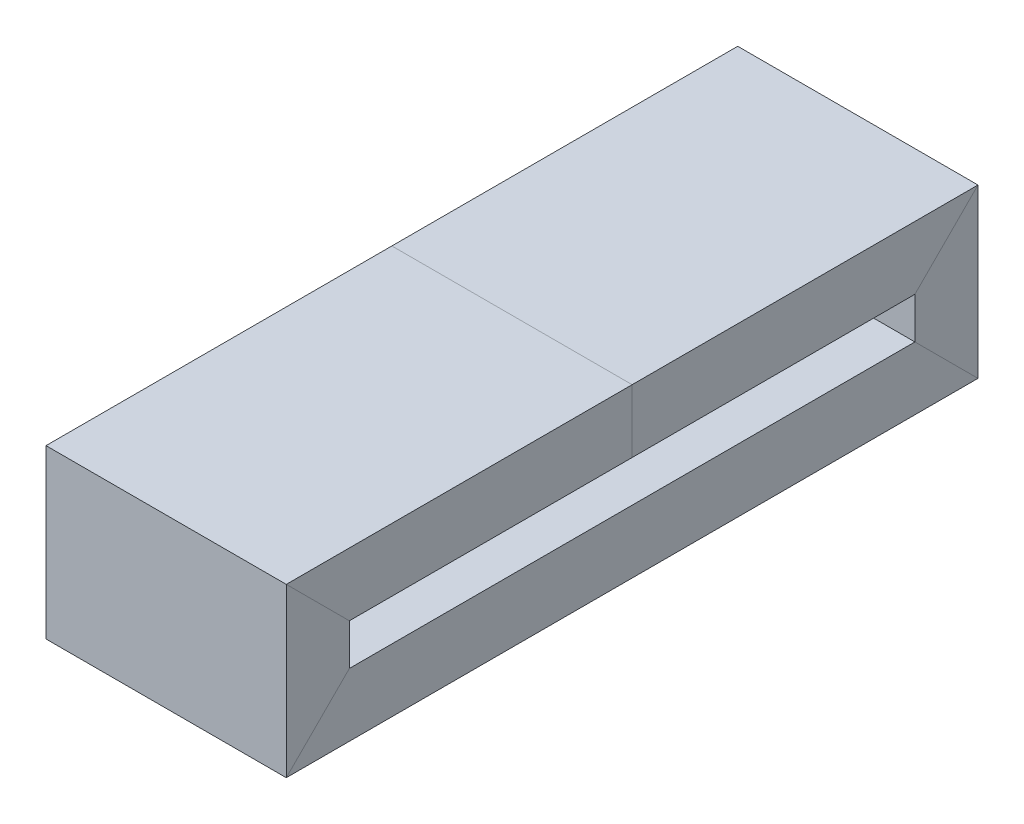
ISO-10303-21;
HEADER;
FILE_DESCRIPTION(('STEP AP214'),'2;1');
FILE_NAME('part.step','',(''),(''),'','','');
FILE_SCHEMA(('AUTOMOTIVE_DESIGN { 1 0 10303 214 1 1 1 1 }'));
ENDSEC;
DATA;
#1=APPLICATION_CONTEXT('core data for automotive mechanical design processes');
#2=APPLICATION_PROTOCOL_DEFINITION('international standard','automotive_design',2000,#1);
#3=PRODUCT_CONTEXT('',#1,'mechanical');
#4=PRODUCT('Part','Part','',(#3));
#5=PRODUCT_RELATED_PRODUCT_CATEGORY('part','',(#4));
#6=PRODUCT_DEFINITION_FORMATION('','',#4);
#7=PRODUCT_DEFINITION_CONTEXT('part definition',#1,'design');
#8=PRODUCT_DEFINITION('design','',#6,#7);
#9=PRODUCT_DEFINITION_SHAPE('','',#8);
#10=(LENGTH_UNIT() NAMED_UNIT(*) SI_UNIT(.MILLI.,.METRE.));
#11=(NAMED_UNIT(*) PLANE_ANGLE_UNIT() SI_UNIT($,.RADIAN.));
#12=(NAMED_UNIT(*) SI_UNIT($,.STERADIAN.) SOLID_ANGLE_UNIT());
#13=UNCERTAINTY_MEASURE_WITH_UNIT(LENGTH_MEASURE(1.E-05),#10,'distance_accuracy_value','');
#14=(GEOMETRIC_REPRESENTATION_CONTEXT(3) GLOBAL_UNCERTAINTY_ASSIGNED_CONTEXT((#13)) GLOBAL_UNIT_ASSIGNED_CONTEXT((#10,
#11,#12)) REPRESENTATION_CONTEXT('',''));
#15=CARTESIAN_POINT('',(0.,0.,0.));
#16=DIRECTION('',(0.,0.,1.));
#17=DIRECTION('',(1.,0.,0.));
#18=AXIS2_PLACEMENT_3D('',#15,#16,#17);
#19=CARTESIAN_POINT('',(-4.95,-3.68,11.65));
#20=DIRECTION('',(0.,0.,1.));
#21=DIRECTION('',(1.,0.,0.));
#22=AXIS2_PLACEMENT_3D('',#19,#20,#21);
#23=PLANE('',#22);
#24=DIRECTION('',(0.,1.,0.));
#25=VECTOR('',#24,1.);
#26=CARTESIAN_POINT('',(4.95,-3.68,11.65));
#27=LINE('',#26,#25);
#28=CARTESIAN_POINT('',(4.95,-0.849999999999999,11.65));
#29=VERTEX_POINT('',#28);
#30=CARTESIAN_POINT('',(4.95,0.849999999999999,11.65));
#31=VERTEX_POINT('',#30);
#32=EDGE_CURVE('E40',#29,#31,#27,.T.);
#33=ORIENTED_EDGE('',*,*,#32,.F.);
#34=DIRECTION('',(-1.,0.,0.));
#35=VECTOR('',#34,1.);
#36=CARTESIAN_POINT('',(-4.95,-0.849999999999998,11.65));
#37=LINE('',#36,#35);
#38=CARTESIAN_POINT('',(-4.95,-0.849999999999999,11.65));
#39=VERTEX_POINT('',#38);
#40=EDGE_CURVE('E180',#29,#39,#37,.T.);
#41=ORIENTED_EDGE('',*,*,#40,.T.);
#42=DIRECTION('',(0.,1.,0.));
#43=VECTOR('',#42,1.);
#44=CARTESIAN_POINT('',(-4.95,-3.68,11.65));
#45=LINE('',#44,#43);
#46=CARTESIAN_POINT('',(-4.95,0.849999999999999,11.65));
#47=VERTEX_POINT('',#46);
#48=EDGE_CURVE('E166',#39,#47,#45,.T.);
#49=ORIENTED_EDGE('',*,*,#48,.T.);
#50=DIRECTION('',(-1.,0.,0.));
#51=VECTOR('',#50,1.);
#52=CARTESIAN_POINT('',(-4.95,0.85,11.65));
#53=LINE('',#52,#51);
#54=EDGE_CURVE('E96',#31,#47,#53,.T.);
#55=ORIENTED_EDGE('',*,*,#54,.F.);
#56=EDGE_LOOP('',(#33,#41,#49,#55));
#57=FACE_BOUND('',#56,.T.);
#58=ADVANCED_FACE('F37',(#57),#23,.F.);
#59=CARTESIAN_POINT('',(-4.95,-3.68,11.65));
#60=DIRECTION('',(1.,0.,0.));
#61=DIRECTION('',(0.,0.,-1.));
#62=AXIS2_PLACEMENT_3D('',#59,#60,#61);
#63=PLANE('',#62);
#64=ORIENTED_EDGE('',*,*,#48,.F.);
#65=DIRECTION('',(0.,-0.707106781186548,0.707106781186548));
#66=VECTOR('',#65,1.);
#67=CARTESIAN_POINT('',(-4.95,12.215,-1.415));
#68=LINE('',#67,#66);
#69=CARTESIAN_POINT('',(-4.95,-3.45,14.25));
#70=VERTEX_POINT('',#69);
#71=EDGE_CURVE('E175',#39,#70,#68,.T.);
#72=ORIENTED_EDGE('',*,*,#71,.T.);
#73=DIRECTION('',(0.,1.,0.));
#74=VECTOR('',#73,1.);
#75=CARTESIAN_POINT('',(-4.95,-3.68,14.25));
#76=LINE('',#75,#74);
#77=CARTESIAN_POINT('',(-4.95,3.45,14.25));
#78=VERTEX_POINT('',#77);
#79=EDGE_CURVE('E124',#70,#78,#76,.T.);
#80=ORIENTED_EDGE('',*,*,#79,.T.);
#81=DIRECTION('',(0.,0.707106781186548,0.707106781186548));
#82=VECTOR('',#81,1.);
#83=CARTESIAN_POINT('',(-4.95,2.265,13.065));
#84=LINE('',#83,#82);
#85=EDGE_CURVE('E112',#47,#78,#84,.T.);
#86=ORIENTED_EDGE('',*,*,#85,.F.);
#87=EDGE_LOOP('',(#64,#72,#80,#86));
#88=FACE_BOUND('',#87,.T.);
#89=ADVANCED_FACE('F173',(#88),#63,.F.);
#90=CARTESIAN_POINT('',(-4.95,-3.68,14.25));
#91=DIRECTION('',(0.,0.,-1.));
#92=DIRECTION('',(-1.,0.,0.));
#93=AXIS2_PLACEMENT_3D('',#90,#91,#92);
#94=PLANE('',#93);
#95=ORIENTED_EDGE('',*,*,#79,.F.);
#96=DIRECTION('',(1.,0.,0.));
#97=VECTOR('',#96,1.);
#98=CARTESIAN_POINT('',(-4.95,-3.45,14.25));
#99=LINE('',#98,#97);
#100=CARTESIAN_POINT('',(4.95,-3.45,14.25));
#101=VERTEX_POINT('',#100);
#102=EDGE_CURVE('E120',#70,#101,#99,.T.);
#103=ORIENTED_EDGE('',*,*,#102,.T.);
#104=DIRECTION('',(0.,1.,0.));
#105=VECTOR('',#104,1.);
#106=CARTESIAN_POINT('',(4.95,-3.68,14.25));
#107=LINE('',#106,#105);
#108=CARTESIAN_POINT('',(4.95,3.45,14.25));
#109=VERTEX_POINT('',#108);
#110=EDGE_CURVE('E117',#101,#109,#107,.T.);
#111=ORIENTED_EDGE('',*,*,#110,.T.);
#112=DIRECTION('',(1.,0.,0.));
#113=VECTOR('',#112,1.);
#114=CARTESIAN_POINT('',(-4.95,3.45,14.25));
#115=LINE('',#114,#113);
#116=EDGE_CURVE('E102',#78,#109,#115,.T.);
#117=ORIENTED_EDGE('',*,*,#116,.F.);
#118=EDGE_LOOP('',(#95,#103,#111,#117));
#119=FACE_BOUND('',#118,.T.);
#120=ADVANCED_FACE('F119',(#119),#94,.F.);
#121=CARTESIAN_POINT('',(4.95,-3.68,11.65));
#122=DIRECTION('',(-1.,0.,0.));
#123=DIRECTION('',(0.,0.,1.));
#124=AXIS2_PLACEMENT_3D('',#121,#122,#123);
#125=PLANE('',#124);
#126=ORIENTED_EDGE('',*,*,#110,.F.);
#127=DIRECTION('',(0.,0.707106781186548,-0.707106781186548));
#128=VECTOR('',#127,1.);
#129=CARTESIAN_POINT('',(4.95,12.215,-1.415));
#130=LINE('',#129,#128);
#131=EDGE_CURVE('E201',#101,#29,#130,.T.);
#132=ORIENTED_EDGE('',*,*,#131,.T.);
#133=ORIENTED_EDGE('',*,*,#32,.T.);
#134=DIRECTION('',(0.,-0.707106781186548,-0.707106781186548));
#135=VECTOR('',#134,1.);
#136=CARTESIAN_POINT('',(4.95,2.265,13.065));
#137=LINE('',#136,#135);
#138=EDGE_CURVE('E126',#109,#31,#137,.T.);
#139=ORIENTED_EDGE('',*,*,#138,.F.);
#140=EDGE_LOOP('',(#126,#132,#133,#139));
#141=FACE_BOUND('',#140,.T.);
#142=ADVANCED_FACE('F127',(#141),#125,.F.);
#143=CARTESIAN_POINT('',(4.95,0.85,14.48));
#144=DIRECTION('',(-1.,0.,0.));
#145=DIRECTION('',(0.,0.,1.));
#146=AXIS2_PLACEMENT_3D('',#143,#144,#145);
#147=PLANE('',#146);
#148=ORIENTED_EDGE('',*,*,#138,.T.);
#149=DIRECTION('',(0.,0.,-1.));
#150=VECTOR('',#149,1.);
#151=CARTESIAN_POINT('',(4.95,0.85,14.48));
#152=LINE('',#151,#150);
#153=CARTESIAN_POINT('',(4.95,0.85,0.));
#154=VERTEX_POINT('',#153);
#155=EDGE_CURVE('E136',#31,#154,#152,.T.);
#156=ORIENTED_EDGE('',*,*,#155,.T.);
#157=DIRECTION('',(0.,1.,0.));
#158=VECTOR('',#157,1.);
#159=CARTESIAN_POINT('',(4.95,0.85,0.));
#160=LINE('',#159,#158);
#161=CARTESIAN_POINT('',(4.95,3.45,0.));
#162=VERTEX_POINT('',#161);
#163=EDGE_CURVE('E135',#154,#162,#160,.T.);
#164=ORIENTED_EDGE('',*,*,#163,.T.);
#165=DIRECTION('',(0.,0.,-1.));
#166=VECTOR('',#165,1.);
#167=CARTESIAN_POINT('',(4.95,3.45,14.48));
#168=LINE('',#167,#166);
#169=EDGE_CURVE('E107',#109,#162,#168,.T.);
#170=ORIENTED_EDGE('',*,*,#169,.F.);
#171=EDGE_LOOP('',(#148,#156,#164,#170));
#172=FACE_BOUND('',#171,.T.);
#173=ADVANCED_FACE('F133',(#172),#147,.F.);
#174=CARTESIAN_POINT('',(-4.95,3.45,14.48));
#175=DIRECTION('',(0.,-1.,0.));
#176=DIRECTION('',(0.,0.,-1.));
#177=AXIS2_PLACEMENT_3D('',#174,#175,#176);
#178=PLANE('',#177);
#179=ORIENTED_EDGE('',*,*,#116,.T.);
#180=ORIENTED_EDGE('',*,*,#169,.T.);
#181=DIRECTION('',(-1.,0.,0.));
#182=VECTOR('',#181,1.);
#183=CARTESIAN_POINT('',(-4.95,3.45,0.));
#184=LINE('',#183,#182);
#185=CARTESIAN_POINT('',(-4.95,3.45,0.));
#186=VERTEX_POINT('',#185);
#187=EDGE_CURVE('E147',#162,#186,#184,.T.);
#188=ORIENTED_EDGE('',*,*,#187,.T.);
#189=DIRECTION('',(0.,0.,-1.));
#190=VECTOR('',#189,1.);
#191=CARTESIAN_POINT('',(-4.95,3.45,14.48));
#192=LINE('',#191,#190);
#193=EDGE_CURVE('E109',#78,#186,#192,.T.);
#194=ORIENTED_EDGE('',*,*,#193,.F.);
#195=EDGE_LOOP('',(#179,#180,#188,#194));
#196=FACE_BOUND('',#195,.T.);
#197=ADVANCED_FACE('F104',(#196),#178,.F.);
#198=CARTESIAN_POINT('',(-4.95,0.85,14.48));
#199=DIRECTION('',(1.,0.,0.));
#200=DIRECTION('',(0.,0.,-1.));
#201=AXIS2_PLACEMENT_3D('',#198,#199,#200);
#202=PLANE('',#201);
#203=ORIENTED_EDGE('',*,*,#85,.T.);
#204=ORIENTED_EDGE('',*,*,#193,.T.);
#205=DIRECTION('',(0.,-1.,0.));
#206=VECTOR('',#205,1.);
#207=CARTESIAN_POINT('',(-4.95,0.85,0.));
#208=LINE('',#207,#206);
#209=CARTESIAN_POINT('',(-4.95,0.85,0.));
#210=VERTEX_POINT('',#209);
#211=EDGE_CURVE('E149',#186,#210,#208,.T.);
#212=ORIENTED_EDGE('',*,*,#211,.T.);
#213=DIRECTION('',(0.,0.,-1.));
#214=VECTOR('',#213,1.);
#215=CARTESIAN_POINT('',(-4.95,0.85,14.48));
#216=LINE('',#215,#214);
#217=EDGE_CURVE('E138',#47,#210,#216,.T.);
#218=ORIENTED_EDGE('',*,*,#217,.F.);
#219=EDGE_LOOP('',(#203,#204,#212,#218));
#220=FACE_BOUND('',#219,.T.);
#221=ADVANCED_FACE('F272',(#220),#202,.F.);
#222=CARTESIAN_POINT('',(-4.95,0.85,14.48));
#223=DIRECTION('',(0.,1.,0.));
#224=DIRECTION('',(0.,0.,1.));
#225=AXIS2_PLACEMENT_3D('',#222,#223,#224);
#226=PLANE('',#225);
#227=ORIENTED_EDGE('',*,*,#54,.T.);
#228=ORIENTED_EDGE('',*,*,#217,.T.);
#229=DIRECTION('',(1.,0.,0.));
#230=VECTOR('',#229,1.);
#231=CARTESIAN_POINT('',(-4.95,0.85,0.));
#232=LINE('',#231,#230);
#233=EDGE_CURVE('E152',#210,#154,#232,.T.);
#234=ORIENTED_EDGE('',*,*,#233,.T.);
#235=ORIENTED_EDGE('',*,*,#155,.F.);
#236=EDGE_LOOP('',(#227,#228,#234,#235));
#237=FACE_BOUND('',#236,.T.);
#238=ADVANCED_FACE('F254',(#237),#226,.F.);
#239=CARTESIAN_POINT('',(4.95,0.85,0.));
#240=DIRECTION('',(-1.,0.,0.));
#241=DIRECTION('',(0.,0.,1.));
#242=AXIS2_PLACEMENT_3D('',#239,#240,#241);
#243=PLANE('',#242);
#244=DIRECTION('',(0.,0.,-1.));
#245=VECTOR('',#244,1.);
#246=CARTESIAN_POINT('',(4.95,3.45,0.));
#247=LINE('',#246,#245);
#248=CARTESIAN_POINT('',(4.95,3.45,-14.25));
#249=VERTEX_POINT('',#248);
#250=EDGE_CURVE('E158',#162,#249,#247,.T.);
#251=ORIENTED_EDGE('',*,*,#250,.F.);
#252=ORIENTED_EDGE('',*,*,#163,.F.);
#253=DIRECTION('',(0.,0.,-1.));
#254=VECTOR('',#253,1.);
#255=CARTESIAN_POINT('',(4.95,0.85,0.));
#256=LINE('',#255,#254);
#257=CARTESIAN_POINT('',(4.95,0.849999999999999,-11.65));
#258=VERTEX_POINT('',#257);
#259=EDGE_CURVE('E155',#154,#258,#256,.T.);
#260=ORIENTED_EDGE('',*,*,#259,.T.);
#261=DIRECTION('',(0.,-0.707106781186548,0.707106781186548));
#262=VECTOR('',#261,1.);
#263=CARTESIAN_POINT('',(4.95,2.265,-13.065));
#264=LINE('',#263,#262);
#265=EDGE_CURVE('E215',#249,#258,#264,.T.);
#266=ORIENTED_EDGE('',*,*,#265,.F.);
#267=EDGE_LOOP('',(#251,#252,#260,#266));
#268=FACE_BOUND('',#267,.T.);
#269=ADVANCED_FACE('F260',(#268),#243,.F.);
#270=CARTESIAN_POINT('',(-4.95,3.45,0.));
#271=DIRECTION('',(0.,-1.,0.));
#272=DIRECTION('',(0.,0.,-1.));
#273=AXIS2_PLACEMENT_3D('',#270,#271,#272);
#274=PLANE('',#273);
#275=DIRECTION('',(0.,0.,-1.));
#276=VECTOR('',#275,1.);
#277=CARTESIAN_POINT('',(-4.95,3.45,0.));
#278=LINE('',#277,#276);
#279=CARTESIAN_POINT('',(-4.95,3.45,-14.25));
#280=VERTEX_POINT('',#279);
#281=EDGE_CURVE('E161',#186,#280,#278,.T.);
#282=ORIENTED_EDGE('',*,*,#281,.F.);
#283=ORIENTED_EDGE('',*,*,#187,.F.);
#284=ORIENTED_EDGE('',*,*,#250,.T.);
#285=DIRECTION('',(1.,0.,0.));
#286=VECTOR('',#285,1.);
#287=CARTESIAN_POINT('',(-4.95,3.45,-14.25));
#288=LINE('',#287,#286);
#289=EDGE_CURVE('E220',#280,#249,#288,.T.);
#290=ORIENTED_EDGE('',*,*,#289,.F.);
#291=EDGE_LOOP('',(#282,#283,#284,#290));
#292=FACE_BOUND('',#291,.T.);
#293=ADVANCED_FACE('F265',(#292),#274,.F.);
#294=CARTESIAN_POINT('',(-4.95,0.85,0.));
#295=DIRECTION('',(1.,0.,0.));
#296=DIRECTION('',(0.,0.,-1.));
#297=AXIS2_PLACEMENT_3D('',#294,#295,#296);
#298=PLANE('',#297);
#299=DIRECTION('',(0.,0.,-1.));
#300=VECTOR('',#299,1.);
#301=CARTESIAN_POINT('',(-4.95,0.85,0.));
#302=LINE('',#301,#300);
#303=CARTESIAN_POINT('',(-4.95,0.849999999999999,-11.65));
#304=VERTEX_POINT('',#303);
#305=EDGE_CURVE('E113',#210,#304,#302,.T.);
#306=ORIENTED_EDGE('',*,*,#305,.F.);
#307=ORIENTED_EDGE('',*,*,#211,.F.);
#308=ORIENTED_EDGE('',*,*,#281,.T.);
#309=DIRECTION('',(0.,0.707106781186548,-0.707106781186548));
#310=VECTOR('',#309,1.);
#311=CARTESIAN_POINT('',(-4.95,2.265,-13.065));
#312=LINE('',#311,#310);
#313=EDGE_CURVE('E216',#304,#280,#312,.T.);
#314=ORIENTED_EDGE('',*,*,#313,.F.);
#315=EDGE_LOOP('',(#306,#307,#308,#314));
#316=FACE_BOUND('',#315,.T.);
#317=ADVANCED_FACE('F270',(#316),#298,.F.);
#318=CARTESIAN_POINT('',(-4.95,0.85,0.));
#319=DIRECTION('',(0.,1.,0.));
#320=DIRECTION('',(0.,0.,1.));
#321=AXIS2_PLACEMENT_3D('',#318,#319,#320);
#322=PLANE('',#321);
#323=ORIENTED_EDGE('',*,*,#259,.F.);
#324=ORIENTED_EDGE('',*,*,#233,.F.);
#325=ORIENTED_EDGE('',*,*,#305,.T.);
#326=DIRECTION('',(-1.,0.,0.));
#327=VECTOR('',#326,1.);
#328=CARTESIAN_POINT('',(-4.95,0.849999999999997,-11.65));
#329=LINE('',#328,#327);
#330=EDGE_CURVE('E204',#258,#304,#329,.T.);
#331=ORIENTED_EDGE('',*,*,#330,.F.);
#332=EDGE_LOOP('',(#323,#324,#325,#331));
#333=FACE_BOUND('',#332,.T.);
#334=ADVANCED_FACE('F258',(#333),#322,.F.);
#335=CARTESIAN_POINT('',(-4.95,-0.849999999999998,-14.48));
#336=DIRECTION('',(0.,-1.,0.));
#337=DIRECTION('',(0.,0.,-1.));
#338=AXIS2_PLACEMENT_3D('',#335,#336,#337);
#339=PLANE('',#338);
#340=DIRECTION('',(0.,0.,1.));
#341=VECTOR('',#340,1.);
#342=CARTESIAN_POINT('',(4.95,-0.849999999999998,-14.48));
#343=LINE('',#342,#341);
#344=CARTESIAN_POINT('',(4.95,-0.849999999999997,-11.65));
#345=VERTEX_POINT('',#344);
#346=EDGE_CURVE('E194',#345,#29,#343,.T.);
#347=ORIENTED_EDGE('',*,*,#346,.F.);
#348=DIRECTION('',(-1.,0.,0.));
#349=VECTOR('',#348,1.);
#350=CARTESIAN_POINT('',(-4.95,-0.849999999999997,-11.65));
#351=LINE('',#350,#349);
#352=CARTESIAN_POINT('',(-4.95,-0.849999999999997,-11.65));
#353=VERTEX_POINT('',#352);
#354=EDGE_CURVE('E227',#345,#353,#351,.T.);
#355=ORIENTED_EDGE('',*,*,#354,.T.);
#356=DIRECTION('',(0.,0.,1.));
#357=VECTOR('',#356,1.);
#358=CARTESIAN_POINT('',(-4.95,-0.849999999999998,-14.48));
#359=LINE('',#358,#357);
#360=EDGE_CURVE('E130',#353,#39,#359,.T.);
#361=ORIENTED_EDGE('',*,*,#360,.T.);
#362=ORIENTED_EDGE('',*,*,#40,.F.);
#363=EDGE_LOOP('',(#347,#355,#361,#362));
#364=FACE_BOUND('',#363,.T.);
#365=ADVANCED_FACE('F253',(#364),#339,.F.);
#366=CARTESIAN_POINT('',(-4.95,-0.849999999999998,-14.48));
#367=DIRECTION('',(1.,0.,0.));
#368=DIRECTION('',(0.,0.,-1.));
#369=AXIS2_PLACEMENT_3D('',#366,#367,#368);
#370=PLANE('',#369);
#371=ORIENTED_EDGE('',*,*,#360,.F.);
#372=DIRECTION('',(0.,-0.707106781186548,-0.707106781186548));
#373=VECTOR('',#372,1.);
#374=CARTESIAN_POINT('',(-4.95,1.415,-9.385));
#375=LINE('',#374,#373);
#376=CARTESIAN_POINT('',(-4.95,-3.45,-14.25));
#377=VERTEX_POINT('',#376);
#378=EDGE_CURVE('E188',#353,#377,#375,.T.);
#379=ORIENTED_EDGE('',*,*,#378,.T.);
#380=DIRECTION('',(0.,0.,1.));
#381=VECTOR('',#380,1.);
#382=CARTESIAN_POINT('',(-4.95,-3.45,-14.48));
#383=LINE('',#382,#381);
#384=EDGE_CURVE('E184',#377,#70,#383,.T.);
#385=ORIENTED_EDGE('',*,*,#384,.T.);
#386=ORIENTED_EDGE('',*,*,#71,.F.);
#387=EDGE_LOOP('',(#371,#379,#385,#386));
#388=FACE_BOUND('',#387,.T.);
#389=ADVANCED_FACE('F185',(#388),#370,.F.);
#390=CARTESIAN_POINT('',(-4.95,-3.45,-14.48));
#391=DIRECTION('',(0.,1.,0.));
#392=DIRECTION('',(0.,0.,1.));
#393=AXIS2_PLACEMENT_3D('',#390,#391,#392);
#394=PLANE('',#393);
#395=ORIENTED_EDGE('',*,*,#384,.F.);
#396=DIRECTION('',(1.,0.,0.));
#397=VECTOR('',#396,1.);
#398=CARTESIAN_POINT('',(-4.95,-3.45,-14.25));
#399=LINE('',#398,#397);
#400=CARTESIAN_POINT('',(4.95,-3.45,-14.25));
#401=VERTEX_POINT('',#400);
#402=EDGE_CURVE('E219',#377,#401,#399,.T.);
#403=ORIENTED_EDGE('',*,*,#402,.T.);
#404=DIRECTION('',(0.,0.,1.));
#405=VECTOR('',#404,1.);
#406=CARTESIAN_POINT('',(4.95,-3.45,-14.48));
#407=LINE('',#406,#405);
#408=EDGE_CURVE('E192',#401,#101,#407,.T.);
#409=ORIENTED_EDGE('',*,*,#408,.T.);
#410=ORIENTED_EDGE('',*,*,#102,.F.);
#411=EDGE_LOOP('',(#395,#403,#409,#410));
#412=FACE_BOUND('',#411,.T.);
#413=ADVANCED_FACE('F293',(#412),#394,.F.);
#414=CARTESIAN_POINT('',(4.95,-0.849999999999998,-14.48));
#415=DIRECTION('',(-1.,0.,0.));
#416=DIRECTION('',(0.,0.,1.));
#417=AXIS2_PLACEMENT_3D('',#414,#415,#416);
#418=PLANE('',#417);
#419=ORIENTED_EDGE('',*,*,#408,.F.);
#420=DIRECTION('',(0.,0.707106781186548,0.707106781186548));
#421=VECTOR('',#420,1.);
#422=CARTESIAN_POINT('',(4.95,1.415,-9.385));
#423=LINE('',#422,#421);
#424=EDGE_CURVE('E54',#401,#345,#423,.T.);
#425=ORIENTED_EDGE('',*,*,#424,.T.);
#426=ORIENTED_EDGE('',*,*,#346,.T.);
#427=ORIENTED_EDGE('',*,*,#131,.F.);
#428=EDGE_LOOP('',(#419,#425,#426,#427));
#429=FACE_BOUND('',#428,.T.);
#430=ADVANCED_FACE('F231',(#429),#418,.F.);
#431=CARTESIAN_POINT('',(-4.95,3.68,-11.65));
#432=DIRECTION('',(0.,0.,-1.));
#433=DIRECTION('',(-1.,0.,0.));
#434=AXIS2_PLACEMENT_3D('',#431,#432,#433);
#435=PLANE('',#434);
#436=ORIENTED_EDGE('',*,*,#330,.T.);
#437=DIRECTION('',(0.,-1.,0.));
#438=VECTOR('',#437,1.);
#439=CARTESIAN_POINT('',(-4.95,3.68,-11.65));
#440=LINE('',#439,#438);
#441=EDGE_CURVE('E210',#304,#353,#440,.T.);
#442=ORIENTED_EDGE('',*,*,#441,.T.);
#443=ORIENTED_EDGE('',*,*,#354,.F.);
#444=DIRECTION('',(0.,-1.,0.));
#445=VECTOR('',#444,1.);
#446=CARTESIAN_POINT('',(4.95,3.68,-11.65));
#447=LINE('',#446,#445);
#448=EDGE_CURVE('E11',#258,#345,#447,.T.);
#449=ORIENTED_EDGE('',*,*,#448,.F.);
#450=EDGE_LOOP('',(#436,#442,#443,#449));
#451=FACE_BOUND('',#450,.T.);
#452=ADVANCED_FACE('F237',(#451),#435,.F.);
#453=CARTESIAN_POINT('',(-4.95,3.68,-11.65));
#454=DIRECTION('',(1.,0.,0.));
#455=DIRECTION('',(0.,0.,-1.));
#456=AXIS2_PLACEMENT_3D('',#453,#454,#455);
#457=PLANE('',#456);
#458=ORIENTED_EDGE('',*,*,#313,.T.);
#459=DIRECTION('',(0.,-1.,0.));
#460=VECTOR('',#459,1.);
#461=CARTESIAN_POINT('',(-4.95,3.68,-14.25));
#462=LINE('',#461,#460);
#463=EDGE_CURVE('E208',#280,#377,#462,.T.);
#464=ORIENTED_EDGE('',*,*,#463,.T.);
#465=ORIENTED_EDGE('',*,*,#378,.F.);
#466=ORIENTED_EDGE('',*,*,#441,.F.);
#467=EDGE_LOOP('',(#458,#464,#465,#466));
#468=FACE_BOUND('',#467,.T.);
#469=ADVANCED_FACE('F250',(#468),#457,.F.);
#470=CARTESIAN_POINT('',(-4.95,3.68,-14.25));
#471=DIRECTION('',(0.,0.,1.));
#472=DIRECTION('',(1.,0.,0.));
#473=AXIS2_PLACEMENT_3D('',#470,#471,#472);
#474=PLANE('',#473);
#475=ORIENTED_EDGE('',*,*,#289,.T.);
#476=DIRECTION('',(0.,-1.,0.));
#477=VECTOR('',#476,1.);
#478=CARTESIAN_POINT('',(4.95,3.68,-14.25));
#479=LINE('',#478,#477);
#480=EDGE_CURVE('E46',#249,#401,#479,.T.);
#481=ORIENTED_EDGE('',*,*,#480,.T.);
#482=ORIENTED_EDGE('',*,*,#402,.F.);
#483=ORIENTED_EDGE('',*,*,#463,.F.);
#484=EDGE_LOOP('',(#475,#481,#482,#483));
#485=FACE_BOUND('',#484,.T.);
#486=ADVANCED_FACE('F282',(#485),#474,.F.);
#487=CARTESIAN_POINT('',(4.95,3.68,-11.65));
#488=DIRECTION('',(-1.,0.,0.));
#489=DIRECTION('',(0.,0.,1.));
#490=AXIS2_PLACEMENT_3D('',#487,#488,#489);
#491=PLANE('',#490);
#492=ORIENTED_EDGE('',*,*,#265,.T.);
#493=ORIENTED_EDGE('',*,*,#448,.T.);
#494=ORIENTED_EDGE('',*,*,#424,.F.);
#495=ORIENTED_EDGE('',*,*,#480,.F.);
#496=EDGE_LOOP('',(#492,#493,#494,#495));
#497=FACE_BOUND('',#496,.T.);
#498=ADVANCED_FACE('F234',(#497),#491,.F.);
#499=CLOSED_SHELL('',(#58,#89,#120,#142,#173,#197,#221,#238,#269,#293,#317,#334,#365,#389,#413,
#430,#452,#469,#486,#498));
#500=MANIFOLD_SOLID_BREP('B2',#499);
#501=ADVANCED_BREP_SHAPE_REPRESENTATION('',(#18,#500),#14);
#502=SHAPE_DEFINITION_REPRESENTATION(#9,#501);
ENDSEC;
END-ISO-10303-21;
